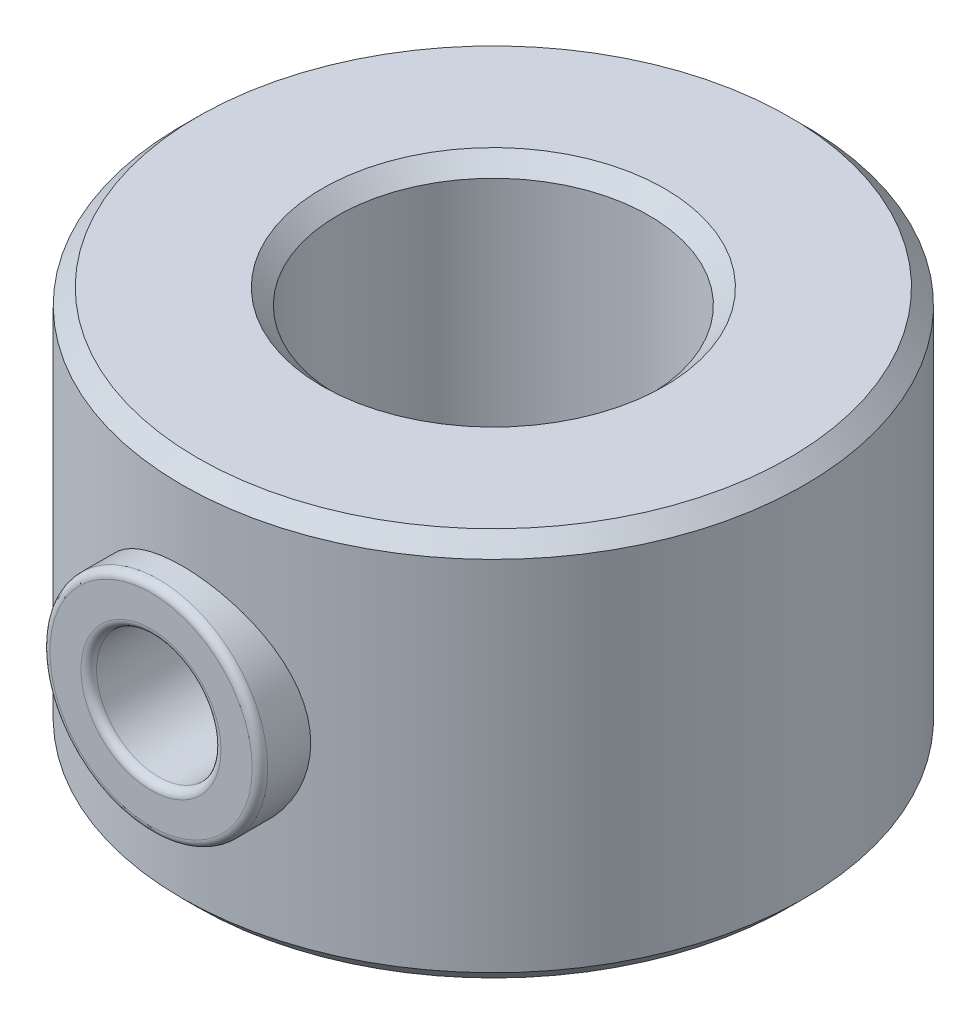
ISO-10303-21;
HEADER;
FILE_DESCRIPTION(('STEP AP214'),'2;1');
FILE_NAME('part.step','',(''),(''),'','','');
FILE_SCHEMA(('AUTOMOTIVE_DESIGN { 1 0 10303 214 1 1 1 1 }'));
ENDSEC;
DATA;
#1=APPLICATION_CONTEXT('core data for automotive mechanical design processes');
#2=APPLICATION_PROTOCOL_DEFINITION('international standard','automotive_design',2000,#1);
#3=PRODUCT_CONTEXT('',#1,'mechanical');
#4=PRODUCT('Part','Part','',(#3));
#5=PRODUCT_RELATED_PRODUCT_CATEGORY('part','',(#4));
#6=PRODUCT_DEFINITION_FORMATION('','',#4);
#7=PRODUCT_DEFINITION_CONTEXT('part definition',#1,'design');
#8=PRODUCT_DEFINITION('design','',#6,#7);
#9=PRODUCT_DEFINITION_SHAPE('','',#8);
#10=(LENGTH_UNIT() NAMED_UNIT(*) SI_UNIT(.MILLI.,.METRE.));
#11=(NAMED_UNIT(*) PLANE_ANGLE_UNIT() SI_UNIT($,.RADIAN.));
#12=(NAMED_UNIT(*) SI_UNIT($,.STERADIAN.) SOLID_ANGLE_UNIT());
#13=UNCERTAINTY_MEASURE_WITH_UNIT(LENGTH_MEASURE(1.E-05),#10,'distance_accuracy_value','');
#14=(GEOMETRIC_REPRESENTATION_CONTEXT(3) GLOBAL_UNCERTAINTY_ASSIGNED_CONTEXT((#13)) GLOBAL_UNIT_ASSIGNED_CONTEXT((#10,
#11,#12)) REPRESENTATION_CONTEXT('',''));
#15=CARTESIAN_POINT('',(0.,0.,0.));
#16=DIRECTION('',(0.,0.,1.));
#17=DIRECTION('',(1.,0.,0.));
#18=AXIS2_PLACEMENT_3D('',#15,#16,#17);
#19=CARTESIAN_POINT('',(0.,5.,0.));
#20=DIRECTION('',(0.,-1.,0.));
#21=DIRECTION('',(0.,0.,-1.));
#22=AXIS2_PLACEMENT_3D('',#19,#20,#21);
#23=CYLINDRICAL_SURFACE('',#22,4.);
#24=CARTESIAN_POINT('',(0.,0.200000000000001,0.));
#25=DIRECTION('',(0.,1.,0.));
#26=DIRECTION('',(0.,0.,1.));
#27=AXIS2_PLACEMENT_3D('',#24,#25,#26);
#28=CIRCLE('',#27,4.);
#29=CARTESIAN_POINT('',(0.,0.200000000000001,4.));
#30=VERTEX_POINT('',#29);
#31=EDGE_CURVE('E55',#30,#30,#28,.T.);
#32=ORIENTED_EDGE('',*,*,#31,.T.);
#33=EDGE_LOOP('',(#32));
#34=FACE_BOUND('',#33,.T.);
#35=CARTESIAN_POINT('',(0.,4.80000000000001,0.));
#36=DIRECTION('',(0.,1.,0.));
#37=DIRECTION('',(0.,0.,1.));
#38=AXIS2_PLACEMENT_3D('',#35,#36,#37);
#39=CIRCLE('',#38,4.);
#40=CARTESIAN_POINT('',(0.,4.80000000000001,4.));
#41=VERTEX_POINT('',#40);
#42=EDGE_CURVE('E60',#41,#41,#39,.F.);
#43=ORIENTED_EDGE('',*,*,#42,.T.);
#44=EDGE_LOOP('',(#43));
#45=FACE_BOUND('',#44,.T.);
#46=CARTESIAN_POINT('',(-1.4,2.5,3.74699879903904));
#47=CARTESIAN_POINT('',(-1.40000122261365,2.42399390862273,3.74699776388767));
#48=CARTESIAN_POINT('',(-1.39378962276713,2.34799633348728,3.74933664554202));
#49=CARTESIAN_POINT('',(-1.36920227474473,2.19826830924879,3.75838443170584));
#50=CARTESIAN_POINT('',(-1.35082551587419,2.1245380490494,3.76509369931098));
#51=CARTESIAN_POINT('',(-1.30264502841368,1.98154132655622,3.78203119046577));
#52=CARTESIAN_POINT('',(-1.27286558017286,1.91226574227798,3.79225193212906));
#53=CARTESIAN_POINT('',(-1.20280928739335,1.77966929303812,3.81504942571639));
#54=CARTESIAN_POINT('',(-1.16252977390218,1.7163499476361,3.8276267764247));
#55=CARTESIAN_POINT('',(-1.07075317586025,1.59472855328695,3.85432936996875));
#56=CARTESIAN_POINT('',(-1.01887795007492,1.53672086246508,3.8684959847411));
#57=CARTESIAN_POINT('',(-0.906187665004617,1.43002500238669,3.8964330153371));
#58=CARTESIAN_POINT('',(-0.845371001675283,1.38133850891669,3.91020335954089));
#59=CARTESIAN_POINT('',(-0.714340074420902,1.29329994843203,3.93628022285839));
#60=CARTESIAN_POINT('',(-0.643903829629458,1.25426076396952,3.94853247960196));
#61=CARTESIAN_POINT('',(-0.4969605736854,1.18870415290058,3.96970144097703));
#62=CARTESIAN_POINT('',(-0.420455386112574,1.16218298143685,3.97861914299944));
#63=CARTESIAN_POINT('',(-0.266635552902491,1.12342656900944,3.99182093758268));
#64=CARTESIAN_POINT('',(-0.189462495240324,1.11068610197917,3.99626844204238));
#65=CARTESIAN_POINT('',(-0.03395424085753,1.0982415298723,4.00061125980262));
#66=CARTESIAN_POINT('',(0.0443806199503948,1.09853372737796,4.00050786421135));
#67=CARTESIAN_POINT('',(0.196395416547973,1.11183584653821,3.99586865876013));
#68=CARTESIAN_POINT('',(0.270130285756384,1.12429601213532,3.99152445421577));
#69=CARTESIAN_POINT('',(0.414387384770313,1.16066521116903,3.97913646942953));
#70=CARTESIAN_POINT('',(0.484909391559923,1.18457503804427,3.97109243279821));
#71=CARTESIAN_POINT('',(0.62188593272715,1.24345972128454,3.9519754787764));
#72=CARTESIAN_POINT('',(0.688271033392251,1.27858250080117,3.9408623543194));
#73=CARTESIAN_POINT('',(0.814360469605075,1.35877098132958,3.91675169641311));
#74=CARTESIAN_POINT('',(0.874062812822231,1.40383963566837,3.90375360363542));
#75=CARTESIAN_POINT('',(0.988351967627227,1.50536485875926,3.87644049309245));
#76=CARTESIAN_POINT('',(1.04251624470005,1.56228881401705,3.86209212937276));
#77=CARTESIAN_POINT('',(1.14067551353939,1.68452159350659,3.83424945278861));
#78=CARTESIAN_POINT('',(1.18466858554808,1.74983199702105,3.82075530150041));
#79=CARTESIAN_POINT('',(1.26190461283283,1.88844802764474,3.7959552932493));
#80=CARTESIAN_POINT('',(1.29495050781834,1.9618714492035,3.78469088179616));
#81=CARTESIAN_POINT('',(1.34805902978522,2.11373653940351,3.76610381809853));
#82=CARTESIAN_POINT('',(1.36812777496305,2.19217582407382,3.75877930862535));
#83=CARTESIAN_POINT('',(1.39381332247295,2.34771869982798,3.74932842367668));
#84=CARTESIAN_POINT('',(1.40009174907107,2.42469855904212,3.7469643286118));
#85=CARTESIAN_POINT('',(1.39990627070418,2.57863166420456,3.74703400930281));
#86=CARTESIAN_POINT('',(1.39344499552692,2.65558491236639,3.74946679486458));
#87=CARTESIAN_POINT('',(1.36856033581427,2.80412724734444,3.75861734210911));
#88=CARTESIAN_POINT('',(1.35061603778914,2.8758083467704,3.76516330712508));
#89=CARTESIAN_POINT('',(1.3038602748806,3.01512122758302,3.78160789058495));
#90=CARTESIAN_POINT('',(1.27504676280627,3.08275224336361,3.79150714057634));
#91=CARTESIAN_POINT('',(1.20625806193349,3.21460377766817,3.81395980670395));
#92=CARTESIAN_POINT('',(1.16593582780308,3.27862941134812,3.82659220535756));
#93=CARTESIAN_POINT('',(1.0756580025322,3.39924337942557,3.85294274785557));
#94=CARTESIAN_POINT('',(1.02569929687703,3.45582929933202,3.86666124187938));
#95=CARTESIAN_POINT('',(0.914372989794207,3.56311491416967,3.89453247610376));
#96=CARTESIAN_POINT('',(0.852535553972049,3.61333287705774,3.9086687609196));
#97=CARTESIAN_POINT('',(0.720962374448997,3.70272072106339,3.93506149131293));
#98=CARTESIAN_POINT('',(0.651226814300218,3.74189085885819,3.94731798056121));
#99=CARTESIAN_POINT('',(0.506086465372685,3.80774170435537,3.96852854494578));
#100=CARTESIAN_POINT('',(0.430716018146477,3.83449188413042,3.9775009287503));
#101=CARTESIAN_POINT('',(0.276165900027753,3.8748102323871,3.99120774730907));
#102=CARTESIAN_POINT('',(0.196987775727296,3.88838370627018,3.99594388766228));
#103=CARTESIAN_POINT('',(0.0414547535009434,3.90144816504143,4.00050291893498));
#104=CARTESIAN_POINT('',(-0.0348358539042697,3.90162765138887,4.00056602033579));
#105=CARTESIAN_POINT('',(-0.186310029571479,3.88962556150099,3.99637680168082));
#106=CARTESIAN_POINT('',(-0.261493702965778,3.87744516694324,3.99212489416535));
#107=CARTESIAN_POINT('',(-0.407185455763932,3.84153812325355,3.9798804926719));
#108=CARTESIAN_POINT('',(-0.477755223784101,3.81803520806681,3.97196059112352));
#109=CARTESIAN_POINT('',(-0.613969610855894,3.76036291606221,3.95319788602816));
#110=CARTESIAN_POINT('',(-0.67961331144514,3.72619155621778,3.94235453912887));
#111=CARTESIAN_POINT('',(-0.806920234531455,3.64661824681527,3.9183212867831));
#112=CARTESIAN_POINT('',(-0.868326850692307,3.60082884760398,3.90505610763209));
#113=CARTESIAN_POINT('',(-0.982805424431893,3.49995893374943,3.87782955928379));
#114=CARTESIAN_POINT('',(-1.03587457741437,3.44487530553615,3.86386795789247));
#115=CARTESIAN_POINT('',(-1.13457718821049,3.32406516391414,3.83607648636268));
#116=CARTESIAN_POINT('',(-1.17977638411472,3.25797493356523,3.82227993184482));
#117=CARTESIAN_POINT('',(-1.258412207993,3.11870091427343,3.79711875756247));
#118=CARTESIAN_POINT('',(-1.29185035828114,3.04551804494553,3.78575382313109));
#119=CARTESIAN_POINT('',(-1.34550733645541,2.89487828122477,3.76701681621841));
#120=CARTESIAN_POINT('',(-1.36586857581373,2.81747774938029,3.75960188412966));
#121=CARTESIAN_POINT('',(-1.39311123732189,2.66004753386954,3.74959450324237));
#122=CARTESIAN_POINT('',(-1.39999871283502,2.58001904730488,3.74699988884414));
#123=CARTESIAN_POINT('',(-1.4,2.5,3.74699879903904));
#124=B_SPLINE_CURVE_WITH_KNOTS('',3,(#46,#47,#48,#49,#50,#51,#52,#53,#54,#55,#56,#57,#58,#59,
#60,#61,#62,#63,#64,#65,#66,#67,#68,#69,#70,#71,#72,#73,#74,#75,#76,#77,#78,#79,#80,#81,#82,#83,
#84,#85,#86,#87,#88,#89,#90,#91,#92,#93,#94,#95,#96,#97,#98,#99,#100,#101,#102,#103,#104,#105,
#106,#107,#108,#109,#110,#111,#112,#113,#114,#115,#116,#117,#118,#119,#120,#121,#122,#123),
.UNSPECIFIED.,.T.,.F.,(4,2,2,2,2,2,2,2,2,2,2,2,2,2,2,2,2,2,2,2,2,2,2,2,2,2,2,2,2,2,2,2,2,2,2,2,
2,2,4),(0.,0.227721308475358,0.455461538659763,0.682719502323081,0.910035287830708,
1.14627052827175,1.3825481998336,1.62570198917555,1.8687829910648,2.10261389235607,
2.33637845533114,2.56004796521567,2.78373297719376,3.01050009443987,3.23733463871139,
3.47586603961667,3.71444242529663,3.95710565561087,4.19965439654246,4.43028591348695,
4.66086982739881,4.88241035498192,5.10399263005356,5.3331293378953,5.56234022735559,
5.80390693258595,6.04546802496657,6.2856611448589,6.52575751446145,6.75350304980482,
6.98122681338209,7.20462462215141,7.42806398035223,7.66025483630845,7.89252363128308,
8.13509557321962,8.37763610581469,8.61748838623404,8.85723288335298),.UNSPECIFIED.);
#125=CARTESIAN_POINT('',(-1.4,2.5,3.74699879903904));
#126=VERTEX_POINT('',#125);
#127=EDGE_CURVE('E98',#126,#126,#124,.T.);
#128=ORIENTED_EDGE('',*,*,#127,.F.);
#129=EDGE_LOOP('',(#128));
#130=FACE_BOUND('',#129,.T.);
#131=ADVANCED_FACE('F41',(#34,#45,#130),#23,.T.);
#132=CARTESIAN_POINT('',(0.,5.,0.));
#133=DIRECTION('',(0.,-1.,0.));
#134=DIRECTION('',(0.,0.,-1.));
#135=AXIS2_PLACEMENT_3D('',#132,#133,#134);
#136=CYLINDRICAL_SURFACE('',#135,2.);
#137=CARTESIAN_POINT('',(0.,0.200000000000002,0.));
#138=DIRECTION('',(0.,1.,0.));
#139=DIRECTION('',(0.,0.,1.));
#140=AXIS2_PLACEMENT_3D('',#137,#138,#139);
#141=CIRCLE('',#140,2.);
#142=CARTESIAN_POINT('',(0.,0.200000000000002,2.));
#143=VERTEX_POINT('',#142);
#144=EDGE_CURVE('E66',#143,#143,#141,.F.);
#145=ORIENTED_EDGE('',*,*,#144,.T.);
#146=EDGE_LOOP('',(#145));
#147=FACE_BOUND('',#146,.T.);
#148=CARTESIAN_POINT('',(0.,4.8,0.));
#149=DIRECTION('',(0.,1.,0.));
#150=DIRECTION('',(0.,0.,1.));
#151=AXIS2_PLACEMENT_3D('',#148,#149,#150);
#152=CIRCLE('',#151,2.);
#153=CARTESIAN_POINT('',(0.,4.8,2.));
#154=VERTEX_POINT('',#153);
#155=EDGE_CURVE('E70',#154,#154,#152,.T.);
#156=ORIENTED_EDGE('',*,*,#155,.T.);
#157=EDGE_LOOP('',(#156));
#158=FACE_BOUND('',#157,.T.);
#159=CARTESIAN_POINT('',(0.8,2.5,1.83303027798234));
#160=CARTESIAN_POINT('',(0.799995301681515,2.45714420076004,1.83303460662569));
#161=CARTESIAN_POINT('',(0.796535927437741,2.41422778611812,1.83455440993706));
#162=CARTESIAN_POINT('',(0.782827612237092,2.32962606684917,1.84044365675138));
#163=CARTESIAN_POINT('',(0.772561321776852,2.28794419316781,1.84482038154741));
#164=CARTESIAN_POINT('',(0.745694013027482,2.20717882321198,1.85584182316519));
#165=CARTESIAN_POINT('',(0.72911686101017,2.1680861810559,1.86247798542846));
#166=CARTESIAN_POINT('',(0.690168107748644,2.09324597965615,1.87725866038112));
#167=CARTESIAN_POINT('',(0.667797771707,2.05749769233966,1.88540284361569));
#168=CARTESIAN_POINT('',(0.616528789834968,1.98829583910342,1.90280346020413));
#169=CARTESIAN_POINT('',(0.587351743090932,1.95505743082821,1.91209567183498));
#170=CARTESIAN_POINT('',(0.523883642309618,1.89378840107385,1.93044982791524));
#171=CARTESIAN_POINT('',(0.489590808670272,1.86575959948406,1.93951169094549));
#172=CARTESIAN_POINT('',(0.415202524142552,1.81463744120692,1.95681363162742));
#173=CARTESIAN_POINT('',(0.374931586244913,1.79178227941174,1.96500721473427));
#174=CARTESIAN_POINT('',(0.290730129150049,1.75326257264408,1.97921571052619));
#175=CARTESIAN_POINT('',(0.246801107715186,1.73759510168722,1.9852315095387));
#176=CARTESIAN_POINT('',(0.158786570735558,1.71466340542504,1.99415330003314));
#177=CARTESIAN_POINT('',(0.114811593921843,1.70702907436439,1.99719574710143));
#178=CARTESIAN_POINT('',(0.0261065314550613,1.69918860573492,2.00032124273081));
#179=CARTESIAN_POINT('',(-0.0186232663301603,1.69897969762606,2.00040539507725));
#180=CARTESIAN_POINT('',(-0.104892997886124,1.70579310790999,1.99768785128714));
#181=CARTESIAN_POINT('',(-0.146470981149613,1.71240990909877,1.99504798708734));
#182=CARTESIAN_POINT('',(-0.227869243687334,1.7319971505243,1.98739716587516));
#183=CARTESIAN_POINT('',(-0.267689393756063,1.74496805696016,1.98238603488445));
#184=CARTESIAN_POINT('',(-0.345159175404662,1.77705459315052,1.9703872978308));
#185=CARTESIAN_POINT('',(-0.382767049351853,1.79625988592621,1.9633710418672));
#186=CARTESIAN_POINT('',(-0.454323260296229,1.8401860027676,1.94805834071879));
#187=CARTESIAN_POINT('',(-0.488270337086443,1.86490871723905,1.9397614570603));
#188=CARTESIAN_POINT('',(-0.55390753119686,1.92105965437864,1.92208654871334));
#189=CARTESIAN_POINT('',(-0.585303138109456,1.95282155703353,1.91267330608096));
#190=CARTESIAN_POINT('',(-0.64244296615413,2.02119622872839,1.89424664385912));
#191=CARTESIAN_POINT('',(-0.668185337503862,2.05781057926167,1.88523335590539));
#192=CARTESIAN_POINT('',(-0.713961675497172,2.13616760896358,1.86838758976725));
#193=CARTESIAN_POINT('',(-0.733813860693961,2.17802593219353,1.86059565672552));
#194=CARTESIAN_POINT('',(-0.766070503986506,2.2648861961848,1.8475503618693));
#195=CARTESIAN_POINT('',(-0.77847979936176,2.30988607390834,1.84229535169336));
#196=CARTESIAN_POINT('',(-0.794781979532783,2.39881431097442,1.83531903869026));
#197=CARTESIAN_POINT('',(-0.799148838723364,2.44264017884807,1.8334014657923));
#198=CARTESIAN_POINT('',(-0.800624530579607,2.53043088310718,1.83275799150839));
#199=CARTESIAN_POINT('',(-0.797735564237153,2.57439567331114,1.83403112224985));
#200=CARTESIAN_POINT('',(-0.785213157915409,2.65858357398195,1.83942417742853));
#201=CARTESIAN_POINT('',(-0.775973224809382,2.6988771749598,1.84337783119108));
#202=CARTESIAN_POINT('',(-0.751521674764511,2.7773153619144,1.85348020411149));
#203=CARTESIAN_POINT('',(-0.736308733720957,2.81545946924292,1.85962940995497));
#204=CARTESIAN_POINT('',(-0.699654255792582,2.89024094311819,1.8737351274398));
#205=CARTESIAN_POINT('',(-0.677985147305838,2.92675447547778,1.88175481855654));
#206=CARTESIAN_POINT('',(-0.62926608977675,2.99579319497667,1.89860154063135));
#207=CARTESIAN_POINT('',(-0.602213949392793,3.02831674911824,1.90742889958425));
#208=CARTESIAN_POINT('',(-0.541137684672193,3.09094936343968,1.92568366388559));
#209=CARTESIAN_POINT('',(-0.50674617177804,3.12070262611641,1.93510722914081));
#210=CARTESIAN_POINT('',(-0.433233453347538,3.17407083064414,1.95287917827025));
#211=CARTESIAN_POINT('',(-0.394112055387146,3.19768552263889,1.96122751837296));
#212=CARTESIAN_POINT('',(-0.312111973600705,3.23801905058449,1.97593486360114));
#213=CARTESIAN_POINT('',(-0.269234192397627,3.25473953766631,1.98229434496109));
#214=CARTESIAN_POINT('',(-0.18095743636769,3.28061954096305,1.99229085387716));
#215=CARTESIAN_POINT('',(-0.135559844117708,3.28978316057603,1.99592935883017));
#216=CARTESIAN_POINT('',(-0.0467266041385219,3.29980188065015,1.99991603284205));
#217=CARTESIAN_POINT('',(-0.00335619703722279,3.30116005138506,2.00046338697949));
#218=CARTESIAN_POINT('',(0.0829735342932967,3.29685780828636,1.99874416951437));
#219=CARTESIAN_POINT('',(0.125932919757848,3.29119845688575,1.99647802386765));
#220=CARTESIAN_POINT('',(0.208868360778564,3.27338128465661,1.98948605345702));
#221=CARTESIAN_POINT('',(0.248895521859354,3.26142842156978,1.98483792253732));
#222=CARTESIAN_POINT('',(0.326368941903576,3.23157887817527,1.97357979132815));
#223=CARTESIAN_POINT('',(0.36381472330691,3.21368110159186,1.96696942921605));
#224=CARTESIAN_POINT('',(0.436881216742446,3.17155872060426,1.95207237744023));
#225=CARTESIAN_POINT('',(0.47234815472257,3.14708948204597,1.94372451891292));
#226=CARTESIAN_POINT('',(0.538821611409629,3.09288459232843,1.92635761274579));
#227=CARTESIAN_POINT('',(0.569826274298302,3.06314676141595,1.917338288202));
#228=CARTESIAN_POINT('',(0.628480506034396,2.99707391018998,1.89895105423769));
#229=CARTESIAN_POINT('',(0.655803554879611,2.96044445063956,1.88959613042153));
#230=CARTESIAN_POINT('',(0.703938980175759,2.88282314502849,1.87219868590072));
#231=CARTESIAN_POINT('',(0.724750591159995,2.84183078683606,1.86415631954982));
#232=CARTESIAN_POINT('',(0.757596435069324,2.76038511926077,1.85103545783163));
#233=CARTESIAN_POINT('',(0.770251005665682,2.72021390609953,1.84575567444659));
#234=CARTESIAN_POINT('',(0.789087103127354,2.63820583214786,1.83778401441586));
#235=CARTESIAN_POINT('',(0.795286667155206,2.59637395361322,1.8350849282887));
#236=CARTESIAN_POINT('',(0.799385703324069,2.53624897506483,1.83329783503054));
#237=CARTESIAN_POINT('',(0.800001987597952,2.51812991160096,1.83302844677343));
#238=CARTESIAN_POINT('',(0.8,2.5,1.83303027798234));
#239=B_SPLINE_CURVE_WITH_KNOTS('',3,(#159,#160,#161,#162,#163,#164,#165,#166,#167,#168,#169,
#170,#171,#172,#173,#174,#175,#176,#177,#178,#179,#180,#181,#182,#183,#184,#185,#186,#187,#188,
#189,#190,#191,#192,#193,#194,#195,#196,#197,#198,#199,#200,#201,#202,#203,#204,#205,#206,#207,
#208,#209,#210,#211,#212,#213,#214,#215,#216,#217,#218,#219,#220,#221,#222,#223,#224,#225,#226,
#227,#228,#229,#230,#231,#232,#233,#234,#235,#236,#237,#238),.UNSPECIFIED.,.T.,.F.,(4,2,2,2,2,2,
2,2,2,2,2,2,2,2,2,2,2,2,2,2,2,2,2,2,2,2,2,2,2,2,2,2,2,2,2,2,2,2,2,4),(0.,0.128511059507061,
0.257350934328898,0.385708329317356,0.514037715295445,0.649022473137698,0.784054297393369,
0.924410676365712,1.06470986787792,1.19821673154873,1.33167378122269,1.45763457932121,
1.58360462051624,1.71147320093959,1.83938565976012,1.97569617632542,2.11205122850851,
2.2522578348583,2.39237321917644,2.52392859007372,2.6554440596078,2.77946899231662,
2.90352143458259,3.03260461858684,3.16174045807944,3.30041493696396,3.43909505938703,
3.57774194922729,3.71631350379258,3.84584415899985,3.97535520602645,4.10088797774945,
4.22644391129038,4.35754820453574,4.48870686623286,4.62798501311849,4.76727952701279,
4.89406664325234,5.02049852085301,5.07486442208293),.UNSPECIFIED.);
#240=CARTESIAN_POINT('',(0.8,2.5,1.83303027798234));
#241=VERTEX_POINT('',#240);
#242=EDGE_CURVE('E107',#241,#241,#239,.T.);
#243=ORIENTED_EDGE('',*,*,#242,.F.);
#244=EDGE_LOOP('',(#243));
#245=FACE_BOUND('',#244,.T.);
#246=ADVANCED_FACE('F123',(#147,#158,#245),#136,.F.);
#247=CARTESIAN_POINT('',(0.,5.,0.));
#248=DIRECTION('',(0.,1.,0.));
#249=DIRECTION('',(0.,0.,1.));
#250=AXIS2_PLACEMENT_3D('',#247,#248,#249);
#251=PLANE('',#250);
#252=CARTESIAN_POINT('',(0.,5.,0.));
#253=DIRECTION('',(0.,1.,0.));
#254=DIRECTION('',(0.,0.,1.));
#255=AXIS2_PLACEMENT_3D('',#252,#253,#254);
#256=CIRCLE('',#255,2.2);
#257=CARTESIAN_POINT('',(0.,5.,2.2));
#258=VERTEX_POINT('',#257);
#259=EDGE_CURVE('E10',#258,#258,#256,.F.);
#260=ORIENTED_EDGE('',*,*,#259,.T.);
#261=EDGE_LOOP('',(#260));
#262=FACE_BOUND('',#261,.T.);
#263=CARTESIAN_POINT('',(0.,5.,0.));
#264=DIRECTION('',(0.,1.,0.));
#265=DIRECTION('',(0.,0.,1.));
#266=AXIS2_PLACEMENT_3D('',#263,#264,#265);
#267=CIRCLE('',#266,3.8);
#268=CARTESIAN_POINT('',(0.,5.,3.8));
#269=VERTEX_POINT('',#268);
#270=EDGE_CURVE('E50',#269,#269,#267,.T.);
#271=ORIENTED_EDGE('',*,*,#270,.T.);
#272=EDGE_LOOP('',(#271));
#273=FACE_BOUND('',#272,.T.);
#274=ADVANCED_FACE('F127',(#262,#273),#251,.T.);
#275=CARTESIAN_POINT('',(0.,0.,0.));
#276=DIRECTION('',(0.,1.,0.));
#277=DIRECTION('',(0.,0.,1.));
#278=AXIS2_PLACEMENT_3D('',#275,#276,#277);
#279=PLANE('',#278);
#280=CARTESIAN_POINT('',(0.,0.,0.));
#281=DIRECTION('',(0.,1.,0.));
#282=DIRECTION('',(0.,0.,1.));
#283=AXIS2_PLACEMENT_3D('',#280,#281,#282);
#284=CIRCLE('',#283,2.2);
#285=CARTESIAN_POINT('',(0.,0.,2.2));
#286=VERTEX_POINT('',#285);
#287=EDGE_CURVE('E74',#286,#286,#284,.T.);
#288=ORIENTED_EDGE('',*,*,#287,.T.);
#289=EDGE_LOOP('',(#288));
#290=FACE_BOUND('',#289,.T.);
#291=CARTESIAN_POINT('',(0.,0.,0.));
#292=DIRECTION('',(0.,1.,0.));
#293=DIRECTION('',(0.,0.,1.));
#294=AXIS2_PLACEMENT_3D('',#291,#292,#293);
#295=CIRCLE('',#294,3.8);
#296=CARTESIAN_POINT('',(0.,0.,3.8));
#297=VERTEX_POINT('',#296);
#298=EDGE_CURVE('E78',#297,#297,#295,.F.);
#299=ORIENTED_EDGE('',*,*,#298,.T.);
#300=EDGE_LOOP('',(#299));
#301=FACE_BOUND('',#300,.T.);
#302=ADVANCED_FACE('F121',(#290,#301),#279,.F.);
#303=CARTESIAN_POINT('',(0.,2.5,4.4));
#304=DIRECTION('',(0.,0.,-1.));
#305=DIRECTION('',(-1.,0.,0.));
#306=AXIS2_PLACEMENT_3D('',#303,#304,#305);
#307=CYLINDRICAL_SURFACE('',#306,1.4);
#308=CARTESIAN_POINT('',(0.,2.5,4.3));
#309=DIRECTION('',(0.,0.,1.));
#310=DIRECTION('',(1.,0.,0.));
#311=AXIS2_PLACEMENT_3D('',#308,#309,#310);
#312=CIRCLE('',#311,1.4);
#313=CARTESIAN_POINT('',(1.4,2.5,4.3));
#314=VERTEX_POINT('',#313);
#315=EDGE_CURVE('E82',#314,#314,#312,.F.);
#316=ORIENTED_EDGE('',*,*,#315,.T.);
#317=EDGE_LOOP('',(#316));
#318=FACE_BOUND('',#317,.T.);
#319=ORIENTED_EDGE('',*,*,#127,.T.);
#320=EDGE_LOOP('',(#319));
#321=FACE_BOUND('',#320,.T.);
#322=ADVANCED_FACE('F116',(#318,#321),#307,.T.);
#323=CARTESIAN_POINT('',(0.,2.5,4.4));
#324=DIRECTION('',(0.,0.,1.));
#325=DIRECTION('',(1.,0.,0.));
#326=AXIS2_PLACEMENT_3D('',#323,#324,#325);
#327=PLANE('',#326);
#328=CARTESIAN_POINT('',(0.,2.5,4.4));
#329=DIRECTION('',(0.,0.,1.));
#330=DIRECTION('',(1.,0.,0.));
#331=AXIS2_PLACEMENT_3D('',#328,#329,#330);
#332=CIRCLE('',#331,0.9);
#333=CARTESIAN_POINT('',(0.9,2.5,4.4));
#334=VERTEX_POINT('',#333);
#335=EDGE_CURVE('E86',#334,#334,#332,.F.);
#336=ORIENTED_EDGE('',*,*,#335,.T.);
#337=EDGE_LOOP('',(#336));
#338=FACE_BOUND('',#337,.T.);
#339=CARTESIAN_POINT('',(0.,2.5,4.4));
#340=DIRECTION('',(0.,0.,1.));
#341=DIRECTION('',(1.,0.,0.));
#342=AXIS2_PLACEMENT_3D('',#339,#340,#341);
#343=CIRCLE('',#342,1.3);
#344=CARTESIAN_POINT('',(1.3,2.5,4.4));
#345=VERTEX_POINT('',#344);
#346=EDGE_CURVE('E90',#345,#345,#343,.T.);
#347=ORIENTED_EDGE('',*,*,#346,.T.);
#348=EDGE_LOOP('',(#347));
#349=FACE_BOUND('',#348,.T.);
#350=ADVANCED_FACE('F120',(#338,#349),#327,.T.);
#351=CARTESIAN_POINT('',(0.,2.5,0.2));
#352=DIRECTION('',(0.,0.,1.));
#353=DIRECTION('',(1.,0.,0.));
#354=AXIS2_PLACEMENT_3D('',#351,#352,#353);
#355=CYLINDRICAL_SURFACE('',#354,0.8);
#356=CARTESIAN_POINT('',(0.,2.5,4.3));
#357=DIRECTION('',(0.,0.,1.));
#358=DIRECTION('',(1.,0.,0.));
#359=AXIS2_PLACEMENT_3D('',#356,#357,#358);
#360=CIRCLE('',#359,0.8);
#361=CARTESIAN_POINT('',(0.8,2.5,4.3));
#362=VERTEX_POINT('',#361);
#363=EDGE_CURVE('E94',#362,#362,#360,.T.);
#364=ORIENTED_EDGE('',*,*,#363,.T.);
#365=EDGE_LOOP('',(#364));
#366=FACE_BOUND('',#365,.T.);
#367=ORIENTED_EDGE('',*,*,#242,.T.);
#368=EDGE_LOOP('',(#367));
#369=FACE_BOUND('',#368,.T.);
#370=ADVANCED_FACE('F179',(#366,#369),#355,.F.);
#371=CARTESIAN_POINT('',(0.,2.5,4.3));
#372=DIRECTION('',(0.,0.,1.));
#373=DIRECTION('',(1.,0.,0.));
#374=AXIS2_PLACEMENT_3D('',#371,#372,#373);
#375=TOROIDAL_SURFACE('',#374,0.9,0.1);
#376=ORIENTED_EDGE('',*,*,#335,.F.);
#377=EDGE_LOOP('',(#376));
#378=FACE_BOUND('',#377,.T.);
#379=ORIENTED_EDGE('',*,*,#363,.F.);
#380=EDGE_LOOP('',(#379));
#381=FACE_BOUND('',#380,.T.);
#382=ADVANCED_FACE('F176',(#378,#381),#375,.T.);
#383=CARTESIAN_POINT('',(0.,2.5,4.3));
#384=DIRECTION('',(0.,0.,1.));
#385=DIRECTION('',(1.,0.,0.));
#386=AXIS2_PLACEMENT_3D('',#383,#384,#385);
#387=TOROIDAL_SURFACE('',#386,1.3,0.1);
#388=ORIENTED_EDGE('',*,*,#315,.F.);
#389=EDGE_LOOP('',(#388));
#390=FACE_BOUND('',#389,.T.);
#391=ORIENTED_EDGE('',*,*,#346,.F.);
#392=EDGE_LOOP('',(#391));
#393=FACE_BOUND('',#392,.T.);
#394=ADVANCED_FACE('F173',(#390,#393),#387,.T.);
#395=CARTESIAN_POINT('',(0.,0.,0.));
#396=DIRECTION('',(0.,-1.,0.));
#397=DIRECTION('',(0.,0.,-1.));
#398=AXIS2_PLACEMENT_3D('',#395,#396,#397);
#399=CONICAL_SURFACE('',#398,2.2,0.785398163397446);
#400=ORIENTED_EDGE('',*,*,#144,.F.);
#401=EDGE_LOOP('',(#400));
#402=FACE_BOUND('',#401,.T.);
#403=ORIENTED_EDGE('',*,*,#287,.F.);
#404=EDGE_LOOP('',(#403));
#405=FACE_BOUND('',#404,.T.);
#406=ADVANCED_FACE('F157',(#402,#405),#399,.F.);
#407=CARTESIAN_POINT('',(0.,0.200000000000001,0.));
#408=DIRECTION('',(0.,1.,0.));
#409=DIRECTION('',(0.,0.,1.));
#410=AXIS2_PLACEMENT_3D('',#407,#408,#409);
#411=CONICAL_SURFACE('',#410,4.,0.78539816339745);
#412=ORIENTED_EDGE('',*,*,#298,.F.);
#413=EDGE_LOOP('',(#412));
#414=FACE_BOUND('',#413,.T.);
#415=ORIENTED_EDGE('',*,*,#31,.F.);
#416=EDGE_LOOP('',(#415));
#417=FACE_BOUND('',#416,.T.);
#418=ADVANCED_FACE('F152',(#414,#417),#411,.T.);
#419=CARTESIAN_POINT('',(0.,4.8,0.));
#420=DIRECTION('',(0.,1.,0.));
#421=DIRECTION('',(0.,0.,1.));
#422=AXIS2_PLACEMENT_3D('',#419,#420,#421);
#423=CONICAL_SURFACE('',#422,2.,0.785398163397453);
#424=ORIENTED_EDGE('',*,*,#259,.F.);
#425=EDGE_LOOP('',(#424));
#426=FACE_BOUND('',#425,.T.);
#427=ORIENTED_EDGE('',*,*,#155,.F.);
#428=EDGE_LOOP('',(#427));
#429=FACE_BOUND('',#428,.T.);
#430=ADVANCED_FACE('F148',(#426,#429),#423,.F.);
#431=CARTESIAN_POINT('',(0.,5.,0.));
#432=DIRECTION('',(0.,-1.,0.));
#433=DIRECTION('',(0.,0.,-1.));
#434=AXIS2_PLACEMENT_3D('',#431,#432,#433);
#435=CONICAL_SURFACE('',#434,3.8,0.785398163397448);
#436=ORIENTED_EDGE('',*,*,#42,.F.);
#437=EDGE_LOOP('',(#436));
#438=FACE_BOUND('',#437,.T.);
#439=ORIENTED_EDGE('',*,*,#270,.F.);
#440=EDGE_LOOP('',(#439));
#441=FACE_BOUND('',#440,.T.);
#442=ADVANCED_FACE('F44',(#438,#441),#435,.T.);
#443=CLOSED_SHELL('',(#131,#246,#274,#302,#322,#350,#370,#382,#394,#406,#418,#430,#442));
#444=MANIFOLD_SOLID_BREP('B2',#443);
#445=ADVANCED_BREP_SHAPE_REPRESENTATION('',(#18,#444),#14);
#446=SHAPE_DEFINITION_REPRESENTATION(#9,#445);
ENDSEC;
END-ISO-10303-21;
